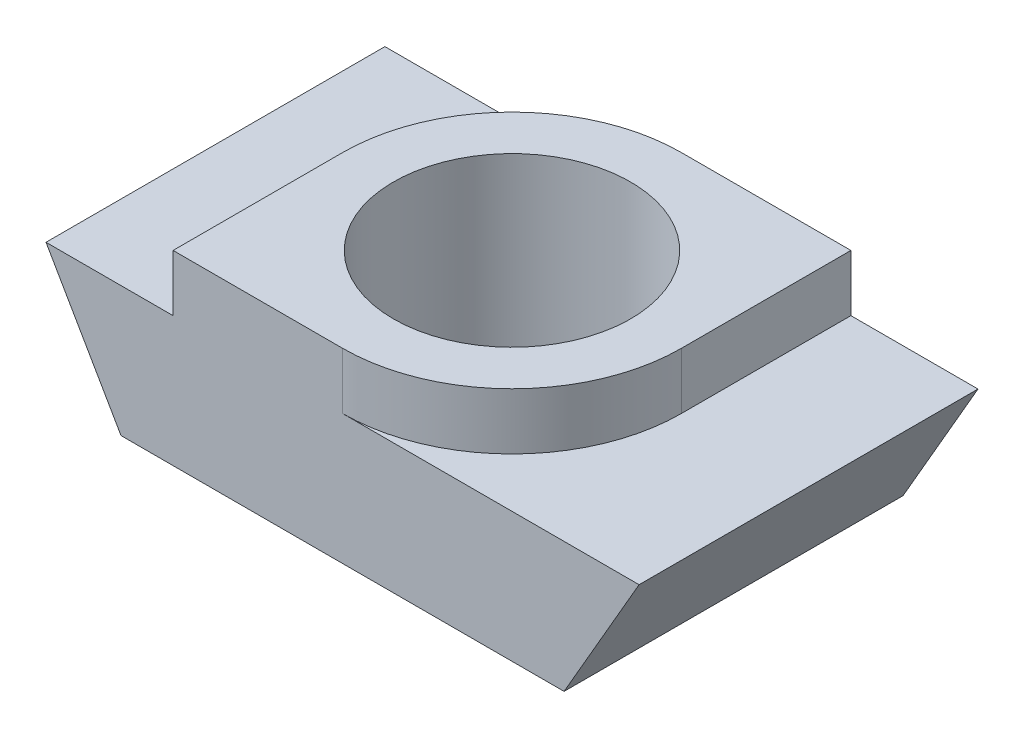
ISO-10303-21;
HEADER;
FILE_DESCRIPTION(('STEP AP214'),'2;1');
FILE_NAME('part.step','',(''),(''),'','','');
FILE_SCHEMA(('AUTOMOTIVE_DESIGN { 1 0 10303 214 1 1 1 1 }'));
ENDSEC;
DATA;
#1=APPLICATION_CONTEXT('core data for automotive mechanical design processes');
#2=APPLICATION_PROTOCOL_DEFINITION('international standard','automotive_design',2000,#1);
#3=PRODUCT_CONTEXT('',#1,'mechanical');
#4=PRODUCT('Part','Part','',(#3));
#5=PRODUCT_RELATED_PRODUCT_CATEGORY('part','',(#4));
#6=PRODUCT_DEFINITION_FORMATION('','',#4);
#7=PRODUCT_DEFINITION_CONTEXT('part definition',#1,'design');
#8=PRODUCT_DEFINITION('design','',#6,#7);
#9=PRODUCT_DEFINITION_SHAPE('','',#8);
#10=(LENGTH_UNIT() NAMED_UNIT(*) SI_UNIT(.MILLI.,.METRE.));
#11=(NAMED_UNIT(*) PLANE_ANGLE_UNIT() SI_UNIT($,.RADIAN.));
#12=(NAMED_UNIT(*) SI_UNIT($,.STERADIAN.) SOLID_ANGLE_UNIT());
#13=UNCERTAINTY_MEASURE_WITH_UNIT(LENGTH_MEASURE(1.E-05),#10,'distance_accuracy_value','');
#14=(GEOMETRIC_REPRESENTATION_CONTEXT(3) GLOBAL_UNCERTAINTY_ASSIGNED_CONTEXT((#13)) GLOBAL_UNIT_ASSIGNED_CONTEXT((#10,
#11,#12)) REPRESENTATION_CONTEXT('',''));
#15=CARTESIAN_POINT('',(0.,0.,0.));
#16=DIRECTION('',(0.,0.,1.));
#17=DIRECTION('',(1.,0.,0.));
#18=AXIS2_PLACEMENT_3D('',#15,#16,#17);
#19=CARTESIAN_POINT('',(3.92209438086385,0.,3.));
#20=DIRECTION('',(-0.866025403784436,0.5,0.));
#21=DIRECTION('',(-0.5,-0.866025403784436,0.));
#22=AXIS2_PLACEMENT_3D('',#19,#20,#21);
#23=PLANE('',#22);
#24=DIRECTION('',(0.5,0.866025403784436,0.));
#25=VECTOR('',#24,1.);
#26=CARTESIAN_POINT('',(3.92209438086385,0.,-3.));
#27=LINE('',#26,#25);
#28=CARTESIAN_POINT('',(3.92209438086385,0.,-3.));
#29=VERTEX_POINT('',#28);
#30=CARTESIAN_POINT('',(5.25,2.3,-3.));
#31=VERTEX_POINT('',#30);
#32=EDGE_CURVE('E114',#29,#31,#27,.T.);
#33=ORIENTED_EDGE('',*,*,#32,.T.);
#34=DIRECTION('',(0.,0.,-1.));
#35=VECTOR('',#34,1.);
#36=CARTESIAN_POINT('',(5.25,2.3,3.));
#37=LINE('',#36,#35);
#38=CARTESIAN_POINT('',(5.25,2.3,3.));
#39=VERTEX_POINT('',#38);
#40=EDGE_CURVE('E97',#39,#31,#37,.T.);
#41=ORIENTED_EDGE('',*,*,#40,.F.);
#42=DIRECTION('',(0.5,0.866025403784436,0.));
#43=VECTOR('',#42,1.);
#44=CARTESIAN_POINT('',(3.92209438086385,0.,3.));
#45=LINE('',#44,#43);
#46=CARTESIAN_POINT('',(3.92209438086385,0.,3.));
#47=VERTEX_POINT('',#46);
#48=EDGE_CURVE('E102',#47,#39,#45,.T.);
#49=ORIENTED_EDGE('',*,*,#48,.F.);
#50=DIRECTION('',(0.,0.,-1.));
#51=VECTOR('',#50,1.);
#52=CARTESIAN_POINT('',(3.92209438086385,0.,3.));
#53=LINE('',#52,#51);
#54=EDGE_CURVE('E169',#47,#29,#53,.T.);
#55=ORIENTED_EDGE('',*,*,#54,.T.);
#56=EDGE_LOOP('',(#33,#41,#49,#55));
#57=FACE_BOUND('',#56,.T.);
#58=ADVANCED_FACE('F17',(#57),#23,.F.);
#59=CARTESIAN_POINT('',(5.25,2.3,3.));
#60=DIRECTION('',(0.,-1.,0.));
#61=DIRECTION('',(1.,0.,0.));
#62=AXIS2_PLACEMENT_3D('',#59,#60,#61);
#63=PLANE('',#62);
#64=DIRECTION('',(-1.,0.,0.));
#65=VECTOR('',#64,1.);
#66=CARTESIAN_POINT('',(5.25,2.3,-3.));
#67=LINE('',#66,#65);
#68=CARTESIAN_POINT('',(3.,2.3,-3.));
#69=VERTEX_POINT('',#68);
#70=EDGE_CURVE('E163',#31,#69,#67,.T.);
#71=ORIENTED_EDGE('',*,*,#70,.T.);
#72=DIRECTION('',(0.,0.,-1.));
#73=VECTOR('',#72,1.);
#74=CARTESIAN_POINT('',(3.,2.3,3.));
#75=LINE('',#74,#73);
#76=CARTESIAN_POINT('',(3.,2.3,0.));
#77=VERTEX_POINT('',#76);
#78=EDGE_CURVE('E116',#77,#69,#75,.T.);
#79=ORIENTED_EDGE('',*,*,#78,.F.);
#80=CARTESIAN_POINT('',(0.,2.3,0.));
#81=DIRECTION('',(0.,-1.,0.));
#82=DIRECTION('',(1.,0.,0.));
#83=AXIS2_PLACEMENT_3D('',#80,#81,#82);
#84=CIRCLE('',#83,3.);
#85=CARTESIAN_POINT('',(0.,2.3,3.));
#86=VERTEX_POINT('',#85);
#87=EDGE_CURVE('E11',#77,#86,#84,.T.);
#88=ORIENTED_EDGE('',*,*,#87,.T.);
#89=DIRECTION('',(-1.,0.,0.));
#90=VECTOR('',#89,1.);
#91=CARTESIAN_POINT('',(5.25,2.3,3.));
#92=LINE('',#91,#90);
#93=EDGE_CURVE('E40',#39,#86,#92,.T.);
#94=ORIENTED_EDGE('',*,*,#93,.F.);
#95=ORIENTED_EDGE('',*,*,#40,.T.);
#96=EDGE_LOOP('',(#71,#79,#88,#94,#95));
#97=FACE_BOUND('',#96,.T.);
#98=ADVANCED_FACE('F95',(#97),#63,.F.);
#99=CARTESIAN_POINT('',(3.,2.3,3.));
#100=DIRECTION('',(-1.,0.,0.));
#101=DIRECTION('',(0.,0.,1.));
#102=AXIS2_PLACEMENT_3D('',#99,#100,#101);
#103=PLANE('',#102);
#104=DIRECTION('',(0.,0.,-1.));
#105=VECTOR('',#104,1.);
#106=CARTESIAN_POINT('',(3.,3.3,3.));
#107=LINE('',#106,#105);
#108=CARTESIAN_POINT('',(3.,3.3,0.));
#109=VERTEX_POINT('',#108);
#110=CARTESIAN_POINT('',(3.,3.3,-3.));
#111=VERTEX_POINT('',#110);
#112=EDGE_CURVE('E121',#109,#111,#107,.T.);
#113=ORIENTED_EDGE('',*,*,#112,.F.);
#114=DIRECTION('',(0.,1.,0.));
#115=VECTOR('',#114,1.);
#116=CARTESIAN_POINT('',(3.,2.3,0.));
#117=LINE('',#116,#115);
#118=EDGE_CURVE('E32',#109,#77,#117,.F.);
#119=ORIENTED_EDGE('',*,*,#118,.T.);
#120=ORIENTED_EDGE('',*,*,#78,.T.);
#121=DIRECTION('',(0.,1.,0.));
#122=VECTOR('',#121,1.);
#123=CARTESIAN_POINT('',(3.,2.3,-3.));
#124=LINE('',#123,#122);
#125=EDGE_CURVE('E159',#69,#111,#124,.T.);
#126=ORIENTED_EDGE('',*,*,#125,.T.);
#127=EDGE_LOOP('',(#113,#119,#120,#126));
#128=FACE_BOUND('',#127,.T.);
#129=ADVANCED_FACE('F192',(#128),#103,.F.);
#130=CARTESIAN_POINT('',(3.,3.3,3.));
#131=DIRECTION('',(0.,-1.,0.));
#132=DIRECTION('',(0.,0.,-1.));
#133=AXIS2_PLACEMENT_3D('',#130,#131,#132);
#134=PLANE('',#133);
#135=CARTESIAN_POINT('',(0.,3.3,0.));
#136=DIRECTION('',(0.,1.,0.));
#137=DIRECTION('',(0.,0.,1.));
#138=AXIS2_PLACEMENT_3D('',#135,#136,#137);
#139=CIRCLE('',#138,2.1);
#140=CARTESIAN_POINT('',(0.,3.3,2.1));
#141=VERTEX_POINT('',#140);
#142=EDGE_CURVE('E317',#141,#141,#139,.T.);
#143=ORIENTED_EDGE('',*,*,#142,.F.);
#144=EDGE_LOOP('',(#143));
#145=FACE_BOUND('',#144,.T.);
#146=DIRECTION('',(-1.,0.,0.));
#147=VECTOR('',#146,1.);
#148=CARTESIAN_POINT('',(3.,3.3,-3.));
#149=LINE('',#148,#147);
#150=CARTESIAN_POINT('',(0.,3.3,-3.));
#151=VERTEX_POINT('',#150);
#152=EDGE_CURVE('E152',#111,#151,#149,.T.);
#153=ORIENTED_EDGE('',*,*,#152,.T.);
#154=CARTESIAN_POINT('',(0.,3.3,0.));
#155=DIRECTION('',(0.,-1.,0.));
#156=DIRECTION('',(0.,0.,-1.));
#157=AXIS2_PLACEMENT_3D('',#154,#155,#156);
#158=CIRCLE('',#157,3.);
#159=CARTESIAN_POINT('',(-3.,3.3,0.));
#160=VERTEX_POINT('',#159);
#161=EDGE_CURVE('E128',#151,#160,#158,.F.);
#162=ORIENTED_EDGE('',*,*,#161,.T.);
#163=DIRECTION('',(0.,0.,-1.));
#164=VECTOR('',#163,1.);
#165=CARTESIAN_POINT('',(-3.,3.3,3.));
#166=LINE('',#165,#164);
#167=CARTESIAN_POINT('',(-3.,3.3,3.));
#168=VERTEX_POINT('',#167);
#169=EDGE_CURVE('E177',#168,#160,#166,.T.);
#170=ORIENTED_EDGE('',*,*,#169,.F.);
#171=DIRECTION('',(-1.,0.,0.));
#172=VECTOR('',#171,1.);
#173=CARTESIAN_POINT('',(3.,3.3,3.));
#174=LINE('',#173,#172);
#175=CARTESIAN_POINT('',(0.,3.3,3.));
#176=VERTEX_POINT('',#175);
#177=EDGE_CURVE('E101',#176,#168,#174,.T.);
#178=ORIENTED_EDGE('',*,*,#177,.F.);
#179=CARTESIAN_POINT('',(0.,3.3,0.));
#180=DIRECTION('',(0.,-1.,0.));
#181=DIRECTION('',(0.,0.,-1.));
#182=AXIS2_PLACEMENT_3D('',#179,#180,#181);
#183=CIRCLE('',#182,3.);
#184=EDGE_CURVE('E126',#176,#109,#183,.F.);
#185=ORIENTED_EDGE('',*,*,#184,.T.);
#186=ORIENTED_EDGE('',*,*,#112,.T.);
#187=EDGE_LOOP('',(#153,#162,#170,#178,#185,#186));
#188=FACE_BOUND('',#187,.T.);
#189=ADVANCED_FACE('F155',(#145,#188),#134,.F.);
#190=CARTESIAN_POINT('',(-3.,2.3,3.));
#191=DIRECTION('',(1.,0.,0.));
#192=DIRECTION('',(0.,0.,-1.));
#193=AXIS2_PLACEMENT_3D('',#190,#191,#192);
#194=PLANE('',#193);
#195=ORIENTED_EDGE('',*,*,#169,.T.);
#196=DIRECTION('',(0.,-1.,0.));
#197=VECTOR('',#196,1.);
#198=CARTESIAN_POINT('',(-3.,2.3,0.));
#199=LINE('',#198,#197);
#200=CARTESIAN_POINT('',(-3.,2.3,0.));
#201=VERTEX_POINT('',#200);
#202=EDGE_CURVE('E115',#160,#201,#199,.T.);
#203=ORIENTED_EDGE('',*,*,#202,.T.);
#204=DIRECTION('',(0.,0.,-1.));
#205=VECTOR('',#204,1.);
#206=CARTESIAN_POINT('',(-3.,2.3,3.));
#207=LINE('',#206,#205);
#208=CARTESIAN_POINT('',(-3.,2.3,3.));
#209=VERTEX_POINT('',#208);
#210=EDGE_CURVE('E142',#209,#201,#207,.T.);
#211=ORIENTED_EDGE('',*,*,#210,.F.);
#212=DIRECTION('',(0.,-1.,0.));
#213=VECTOR('',#212,1.);
#214=CARTESIAN_POINT('',(-3.,2.3,3.));
#215=LINE('',#214,#213);
#216=EDGE_CURVE('E181',#168,#209,#215,.T.);
#217=ORIENTED_EDGE('',*,*,#216,.F.);
#218=EDGE_LOOP('',(#195,#203,#211,#217));
#219=FACE_BOUND('',#218,.T.);
#220=ADVANCED_FACE('F180',(#219),#194,.F.);
#221=CARTESIAN_POINT('',(-5.25,2.3,3.));
#222=DIRECTION('',(0.,-1.,0.));
#223=DIRECTION('',(1.,0.,0.));
#224=AXIS2_PLACEMENT_3D('',#221,#222,#223);
#225=PLANE('',#224);
#226=DIRECTION('',(-1.,0.,0.));
#227=VECTOR('',#226,1.);
#228=CARTESIAN_POINT('',(-5.25,2.3,-3.));
#229=LINE('',#228,#227);
#230=CARTESIAN_POINT('',(0.,2.3,-3.));
#231=VERTEX_POINT('',#230);
#232=CARTESIAN_POINT('',(-5.25,2.3,-3.));
#233=VERTEX_POINT('',#232);
#234=EDGE_CURVE('E138',#231,#233,#229,.T.);
#235=ORIENTED_EDGE('',*,*,#234,.T.);
#236=DIRECTION('',(0.,0.,-1.));
#237=VECTOR('',#236,1.);
#238=CARTESIAN_POINT('',(-5.25,2.3,3.));
#239=LINE('',#238,#237);
#240=CARTESIAN_POINT('',(-5.25,2.3,3.));
#241=VERTEX_POINT('',#240);
#242=EDGE_CURVE('E174',#241,#233,#239,.T.);
#243=ORIENTED_EDGE('',*,*,#242,.F.);
#244=DIRECTION('',(-1.,0.,0.));
#245=VECTOR('',#244,1.);
#246=CARTESIAN_POINT('',(-5.25,2.3,3.));
#247=LINE('',#246,#245);
#248=EDGE_CURVE('E184',#209,#241,#247,.T.);
#249=ORIENTED_EDGE('',*,*,#248,.F.);
#250=ORIENTED_EDGE('',*,*,#210,.T.);
#251=CARTESIAN_POINT('',(0.,2.3,0.));
#252=DIRECTION('',(0.,-1.,0.));
#253=DIRECTION('',(1.,0.,0.));
#254=AXIS2_PLACEMENT_3D('',#251,#252,#253);
#255=CIRCLE('',#254,3.);
#256=EDGE_CURVE('E25',#201,#231,#255,.T.);
#257=ORIENTED_EDGE('',*,*,#256,.T.);
#258=EDGE_LOOP('',(#235,#243,#249,#250,#257));
#259=FACE_BOUND('',#258,.T.);
#260=ADVANCED_FACE('F136',(#259),#225,.F.);
#261=CARTESIAN_POINT('',(-3.92209438086384,0.,3.));
#262=DIRECTION('',(0.866025403784436,0.5,0.));
#263=DIRECTION('',(-0.5,0.866025403784436,0.));
#264=AXIS2_PLACEMENT_3D('',#261,#262,#263);
#265=PLANE('',#264);
#266=DIRECTION('',(0.5,-0.866025403784436,0.));
#267=VECTOR('',#266,1.);
#268=CARTESIAN_POINT('',(-3.92209438086384,0.,-3.));
#269=LINE('',#268,#267);
#270=CARTESIAN_POINT('',(-3.92209438086384,0.,-3.));
#271=VERTEX_POINT('',#270);
#272=EDGE_CURVE('E161',#233,#271,#269,.T.);
#273=ORIENTED_EDGE('',*,*,#272,.T.);
#274=DIRECTION('',(0.,0.,-1.));
#275=VECTOR('',#274,1.);
#276=CARTESIAN_POINT('',(-3.92209438086384,0.,3.));
#277=LINE('',#276,#275);
#278=CARTESIAN_POINT('',(-3.92209438086384,0.,3.));
#279=VERTEX_POINT('',#278);
#280=EDGE_CURVE('E171',#279,#271,#277,.T.);
#281=ORIENTED_EDGE('',*,*,#280,.F.);
#282=DIRECTION('',(0.5,-0.866025403784436,0.));
#283=VECTOR('',#282,1.);
#284=CARTESIAN_POINT('',(-3.92209438086384,0.,3.));
#285=LINE('',#284,#283);
#286=EDGE_CURVE('E188',#241,#279,#285,.T.);
#287=ORIENTED_EDGE('',*,*,#286,.F.);
#288=ORIENTED_EDGE('',*,*,#242,.T.);
#289=EDGE_LOOP('',(#273,#281,#287,#288));
#290=FACE_BOUND('',#289,.T.);
#291=ADVANCED_FACE('F221',(#290),#265,.F.);
#292=CARTESIAN_POINT('',(-3.92209438086384,0.,3.));
#293=DIRECTION('',(0.,1.,0.));
#294=DIRECTION('',(-1.,0.,0.));
#295=AXIS2_PLACEMENT_3D('',#292,#293,#294);
#296=PLANE('',#295);
#297=CARTESIAN_POINT('',(0.,0.,0.));
#298=DIRECTION('',(0.,1.,0.));
#299=DIRECTION('',(0.,0.,1.));
#300=AXIS2_PLACEMENT_3D('',#297,#298,#299);
#301=CIRCLE('',#300,2.1);
#302=CARTESIAN_POINT('',(0.,0.,2.1));
#303=VERTEX_POINT('',#302);
#304=EDGE_CURVE('E191',#303,#303,#301,.T.);
#305=ORIENTED_EDGE('',*,*,#304,.T.);
#306=EDGE_LOOP('',(#305));
#307=FACE_BOUND('',#306,.T.);
#308=DIRECTION('',(1.,0.,0.));
#309=VECTOR('',#308,1.);
#310=CARTESIAN_POINT('',(-3.92209438086384,0.,-3.));
#311=LINE('',#310,#309);
#312=EDGE_CURVE('E111',#271,#29,#311,.T.);
#313=ORIENTED_EDGE('',*,*,#312,.T.);
#314=ORIENTED_EDGE('',*,*,#54,.F.);
#315=DIRECTION('',(1.,0.,0.));
#316=VECTOR('',#315,1.);
#317=CARTESIAN_POINT('',(-3.92209438086384,0.,3.));
#318=LINE('',#317,#316);
#319=EDGE_CURVE('E107',#279,#47,#318,.T.);
#320=ORIENTED_EDGE('',*,*,#319,.F.);
#321=ORIENTED_EDGE('',*,*,#280,.T.);
#322=EDGE_LOOP('',(#313,#314,#320,#321));
#323=FACE_BOUND('',#322,.T.);
#324=ADVANCED_FACE('F224',(#307,#323),#296,.F.);
#325=CARTESIAN_POINT('',(0.,0.,3.));
#326=DIRECTION('',(0.,0.,1.));
#327=DIRECTION('',(1.,0.,0.));
#328=AXIS2_PLACEMENT_3D('',#325,#326,#327);
#329=PLANE('',#328);
#330=ORIENTED_EDGE('',*,*,#93,.T.);
#331=DIRECTION('',(0.,1.,0.));
#332=VECTOR('',#331,1.);
#333=CARTESIAN_POINT('',(0.,3.3,3.));
#334=LINE('',#333,#332);
#335=EDGE_CURVE('E130',#86,#176,#334,.T.);
#336=ORIENTED_EDGE('',*,*,#335,.T.);
#337=ORIENTED_EDGE('',*,*,#177,.T.);
#338=ORIENTED_EDGE('',*,*,#216,.T.);
#339=ORIENTED_EDGE('',*,*,#248,.T.);
#340=ORIENTED_EDGE('',*,*,#286,.T.);
#341=ORIENTED_EDGE('',*,*,#319,.T.);
#342=ORIENTED_EDGE('',*,*,#48,.T.);
#343=EDGE_LOOP('',(#330,#336,#337,#338,#339,#340,#341,#342));
#344=FACE_BOUND('',#343,.T.);
#345=ADVANCED_FACE('F105',(#344),#329,.T.);
#346=CARTESIAN_POINT('',(0.,0.,-3.));
#347=DIRECTION('',(0.,0.,1.));
#348=DIRECTION('',(1.,0.,0.));
#349=AXIS2_PLACEMENT_3D('',#346,#347,#348);
#350=PLANE('',#349);
#351=ORIENTED_EDGE('',*,*,#234,.F.);
#352=DIRECTION('',(0.,-1.,0.));
#353=VECTOR('',#352,1.);
#354=CARTESIAN_POINT('',(0.,0.,-3.));
#355=LINE('',#354,#353);
#356=EDGE_CURVE('E119',#231,#151,#355,.F.);
#357=ORIENTED_EDGE('',*,*,#356,.T.);
#358=ORIENTED_EDGE('',*,*,#152,.F.);
#359=ORIENTED_EDGE('',*,*,#125,.F.);
#360=ORIENTED_EDGE('',*,*,#70,.F.);
#361=ORIENTED_EDGE('',*,*,#32,.F.);
#362=ORIENTED_EDGE('',*,*,#312,.F.);
#363=ORIENTED_EDGE('',*,*,#272,.F.);
#364=EDGE_LOOP('',(#351,#357,#358,#359,#360,#361,#362,#363));
#365=FACE_BOUND('',#364,.T.);
#366=ADVANCED_FACE('F150',(#365),#350,.F.);
#367=CARTESIAN_POINT('',(0.,2.3,0.));
#368=DIRECTION('',(0.,-1.,0.));
#369=DIRECTION('',(0.,0.,-1.));
#370=AXIS2_PLACEMENT_3D('',#367,#368,#369);
#371=CYLINDRICAL_SURFACE('',#370,3.);
#372=ORIENTED_EDGE('',*,*,#161,.F.);
#373=ORIENTED_EDGE('',*,*,#356,.F.);
#374=ORIENTED_EDGE('',*,*,#256,.F.);
#375=ORIENTED_EDGE('',*,*,#202,.F.);
#376=EDGE_LOOP('',(#372,#373,#374,#375));
#377=FACE_BOUND('',#376,.T.);
#378=ADVANCED_FACE('F146',(#377),#371,.T.);
#379=CARTESIAN_POINT('',(0.,0.,0.));
#380=DIRECTION('',(0.,-1.,0.));
#381=DIRECTION('',(0.,0.,-1.));
#382=AXIS2_PLACEMENT_3D('',#379,#380,#381);
#383=CYLINDRICAL_SURFACE('',#382,3.);
#384=ORIENTED_EDGE('',*,*,#87,.F.);
#385=ORIENTED_EDGE('',*,*,#118,.F.);
#386=ORIENTED_EDGE('',*,*,#184,.F.);
#387=ORIENTED_EDGE('',*,*,#335,.F.);
#388=EDGE_LOOP('',(#384,#385,#386,#387));
#389=FACE_BOUND('',#388,.T.);
#390=ADVANCED_FACE('F19',(#389),#383,.T.);
#391=CARTESIAN_POINT('',(0.,3.3,0.));
#392=DIRECTION('',(0.,1.,0.));
#393=DIRECTION('',(0.,0.,1.));
#394=AXIS2_PLACEMENT_3D('',#391,#392,#393);
#395=CYLINDRICAL_SURFACE('',#394,2.1);
#396=ORIENTED_EDGE('',*,*,#304,.F.);
#397=EDGE_LOOP('',(#396));
#398=FACE_BOUND('',#397,.T.);
#399=ORIENTED_EDGE('',*,*,#142,.T.);
#400=EDGE_LOOP('',(#399));
#401=FACE_BOUND('',#400,.T.);
#402=ADVANCED_FACE('F195',(#398,#401),#395,.F.);
#403=CLOSED_SHELL('',(#58,#98,#129,#189,#220,#260,#291,#324,#345,#366,#378,#390,#402));
#404=MANIFOLD_SOLID_BREP('B1',#403);
#405=ADVANCED_BREP_SHAPE_REPRESENTATION('',(#18,#404),#14);
#406=SHAPE_DEFINITION_REPRESENTATION(#9,#405);
ENDSEC;
END-ISO-10303-21;
